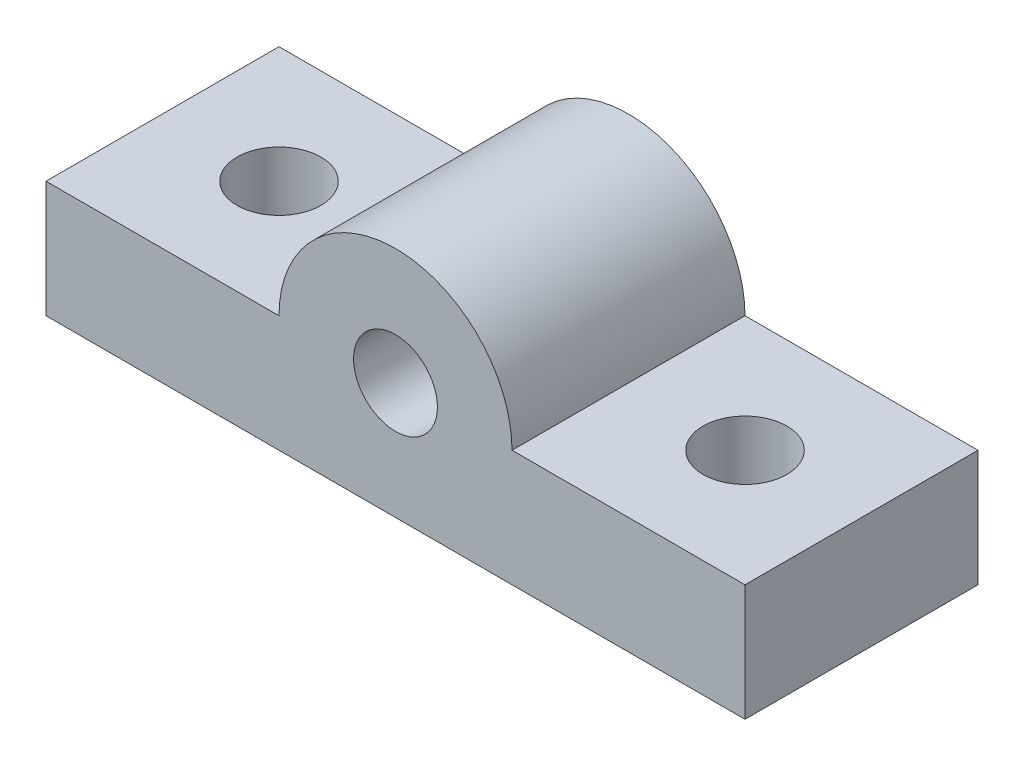
ISO-10303-21;
HEADER;
FILE_DESCRIPTION(('STEP AP214'),'2;1');
FILE_NAME('part.step','',(''),(''),'','','');
FILE_SCHEMA(('AUTOMOTIVE_DESIGN { 1 0 10303 214 1 1 1 1 }'));
ENDSEC;
DATA;
#1=APPLICATION_CONTEXT('core data for automotive mechanical design processes');
#2=APPLICATION_PROTOCOL_DEFINITION('international standard','automotive_design',2000,#1);
#3=PRODUCT_CONTEXT('',#1,'mechanical');
#4=PRODUCT('Part','Part','',(#3));
#5=PRODUCT_RELATED_PRODUCT_CATEGORY('part','',(#4));
#6=PRODUCT_DEFINITION_FORMATION('','',#4);
#7=PRODUCT_DEFINITION_CONTEXT('part definition',#1,'design');
#8=PRODUCT_DEFINITION('design','',#6,#7);
#9=PRODUCT_DEFINITION_SHAPE('','',#8);
#10=(LENGTH_UNIT() NAMED_UNIT(*) SI_UNIT(.MILLI.,.METRE.));
#11=(NAMED_UNIT(*) PLANE_ANGLE_UNIT() SI_UNIT($,.RADIAN.));
#12=(NAMED_UNIT(*) SI_UNIT($,.STERADIAN.) SOLID_ANGLE_UNIT());
#13=UNCERTAINTY_MEASURE_WITH_UNIT(LENGTH_MEASURE(1.E-05),#10,'distance_accuracy_value','');
#14=(GEOMETRIC_REPRESENTATION_CONTEXT(3) GLOBAL_UNCERTAINTY_ASSIGNED_CONTEXT((#13)) GLOBAL_UNIT_ASSIGNED_CONTEXT((#10,
#11,#12)) REPRESENTATION_CONTEXT('',''));
#15=CARTESIAN_POINT('',(0.,0.,0.));
#16=DIRECTION('',(0.,0.,1.));
#17=DIRECTION('',(1.,0.,0.));
#18=AXIS2_PLACEMENT_3D('',#15,#16,#17);
#19=CARTESIAN_POINT('',(0.,6.35,0.));
#20=DIRECTION('',(0.,1.,0.));
#21=DIRECTION('',(0.,0.,1.));
#22=AXIS2_PLACEMENT_3D('',#19,#20,#21);
#23=PLANE('',#22);
#24=DIRECTION('',(0.,0.,1.));
#25=VECTOR('',#24,1.);
#26=CARTESIAN_POINT('',(-6.35000000000001,6.35,-24.3105122421383));
#27=LINE('',#26,#25);
#28=CARTESIAN_POINT('',(-6.35000000000001,6.35,-6.35));
#29=VERTEX_POINT('',#28);
#30=CARTESIAN_POINT('',(-6.35000000000001,6.35,6.35));
#31=VERTEX_POINT('',#30);
#32=EDGE_CURVE('E107',#29,#31,#27,.T.);
#33=ORIENTED_EDGE('',*,*,#32,.F.);
#34=DIRECTION('',(-1.,0.,0.));
#35=VECTOR('',#34,1.);
#36=CARTESIAN_POINT('',(-19.05,6.35,-6.35));
#37=LINE('',#36,#35);
#38=CARTESIAN_POINT('',(-19.05,6.35,-6.35));
#39=VERTEX_POINT('',#38);
#40=EDGE_CURVE('E95',#29,#39,#37,.T.);
#41=ORIENTED_EDGE('',*,*,#40,.T.);
#42=DIRECTION('',(0.,0.,1.));
#43=VECTOR('',#42,1.);
#44=CARTESIAN_POINT('',(-19.05,6.35,-6.35));
#45=LINE('',#44,#43);
#46=CARTESIAN_POINT('',(-19.05,6.35,6.35));
#47=VERTEX_POINT('',#46);
#48=EDGE_CURVE('E148',#39,#47,#45,.T.);
#49=ORIENTED_EDGE('',*,*,#48,.T.);
#50=DIRECTION('',(1.,0.,0.));
#51=VECTOR('',#50,1.);
#52=CARTESIAN_POINT('',(-19.05,6.35,6.35));
#53=LINE('',#52,#51);
#54=EDGE_CURVE('E110',#47,#31,#53,.T.);
#55=ORIENTED_EDGE('',*,*,#54,.T.);
#56=EDGE_LOOP('',(#33,#41,#49,#55));
#57=FACE_BOUND('',#56,.T.);
#58=CARTESIAN_POINT('',(-12.7,6.35,0.));
#59=DIRECTION('',(0.,1.,0.));
#60=DIRECTION('',(0.,0.,1.));
#61=AXIS2_PLACEMENT_3D('',#58,#59,#60);
#62=CIRCLE('',#61,2.286);
#63=CARTESIAN_POINT('',(-12.7,6.35,2.286));
#64=VERTEX_POINT('',#63);
#65=EDGE_CURVE('E136',#64,#64,#62,.T.);
#66=ORIENTED_EDGE('',*,*,#65,.F.);
#67=EDGE_LOOP('',(#66));
#68=FACE_BOUND('',#67,.T.);
#69=ADVANCED_FACE('F43',(#57,#68),#23,.T.);
#70=DIRECTION('',(0.,0.,1.));
#71=VECTOR('',#70,1.);
#72=CARTESIAN_POINT('',(6.34999999999999,6.35,-24.3105122421383));
#73=LINE('',#72,#71);
#74=CARTESIAN_POINT('',(6.34999999999999,6.35,6.35));
#75=VERTEX_POINT('',#74);
#76=CARTESIAN_POINT('',(6.34999999999999,6.35,-6.35));
#77=VERTEX_POINT('',#76);
#78=EDGE_CURVE('E63',#75,#77,#73,.F.);
#79=ORIENTED_EDGE('',*,*,#78,.F.);
#80=CARTESIAN_POINT('',(19.05,6.35,6.35));
#81=VERTEX_POINT('',#80);
#82=EDGE_CURVE('E151',#75,#81,#53,.T.);
#83=ORIENTED_EDGE('',*,*,#82,.T.);
#84=DIRECTION('',(0.,0.,-1.));
#85=VECTOR('',#84,1.);
#86=CARTESIAN_POINT('',(19.05,6.35,-6.35));
#87=LINE('',#86,#85);
#88=CARTESIAN_POINT('',(19.05,6.35,-6.35));
#89=VERTEX_POINT('',#88);
#90=EDGE_CURVE('E104',#81,#89,#87,.T.);
#91=ORIENTED_EDGE('',*,*,#90,.T.);
#92=EDGE_CURVE('E59',#89,#77,#37,.T.);
#93=ORIENTED_EDGE('',*,*,#92,.T.);
#94=EDGE_LOOP('',(#79,#83,#91,#93));
#95=FACE_BOUND('',#94,.T.);
#96=CARTESIAN_POINT('',(12.7,6.35,0.));
#97=DIRECTION('',(0.,1.,0.));
#98=DIRECTION('',(0.,0.,1.));
#99=AXIS2_PLACEMENT_3D('',#96,#97,#98);
#100=CIRCLE('',#99,2.286);
#101=CARTESIAN_POINT('',(12.7,6.35,2.28599999999999));
#102=VERTEX_POINT('',#101);
#103=EDGE_CURVE('E128',#102,#102,#100,.T.);
#104=ORIENTED_EDGE('',*,*,#103,.F.);
#105=EDGE_LOOP('',(#104));
#106=FACE_BOUND('',#105,.T.);
#107=ADVANCED_FACE('F188',(#95,#106),#23,.T.);
#108=CARTESIAN_POINT('',(0.,0.,0.));
#109=DIRECTION('',(0.,1.,0.));
#110=DIRECTION('',(0.,0.,1.));
#111=AXIS2_PLACEMENT_3D('',#108,#109,#110);
#112=PLANE('',#111);
#113=DIRECTION('',(0.,0.,1.));
#114=VECTOR('',#113,1.);
#115=CARTESIAN_POINT('',(-19.05,0.,-6.35));
#116=LINE('',#115,#114);
#117=CARTESIAN_POINT('',(-19.05,0.,-6.35));
#118=VERTEX_POINT('',#117);
#119=CARTESIAN_POINT('',(-19.05,0.,6.35));
#120=VERTEX_POINT('',#119);
#121=EDGE_CURVE('E161',#118,#120,#116,.T.);
#122=ORIENTED_EDGE('',*,*,#121,.F.);
#123=DIRECTION('',(-1.,0.,0.));
#124=VECTOR('',#123,1.);
#125=CARTESIAN_POINT('',(-19.05,0.,-6.35));
#126=LINE('',#125,#124);
#127=CARTESIAN_POINT('',(19.05,0.,-6.35));
#128=VERTEX_POINT('',#127);
#129=EDGE_CURVE('E158',#128,#118,#126,.T.);
#130=ORIENTED_EDGE('',*,*,#129,.F.);
#131=DIRECTION('',(0.,0.,-1.));
#132=VECTOR('',#131,1.);
#133=CARTESIAN_POINT('',(19.05,0.,-6.35));
#134=LINE('',#133,#132);
#135=CARTESIAN_POINT('',(19.05,0.,6.35));
#136=VERTEX_POINT('',#135);
#137=EDGE_CURVE('E140',#136,#128,#134,.T.);
#138=ORIENTED_EDGE('',*,*,#137,.F.);
#139=DIRECTION('',(1.,0.,0.));
#140=VECTOR('',#139,1.);
#141=CARTESIAN_POINT('',(-19.05,0.,6.35));
#142=LINE('',#141,#140);
#143=EDGE_CURVE('E145',#120,#136,#142,.T.);
#144=ORIENTED_EDGE('',*,*,#143,.F.);
#145=EDGE_LOOP('',(#122,#130,#138,#144));
#146=FACE_BOUND('',#145,.T.);
#147=CARTESIAN_POINT('',(-12.7,0.,0.));
#148=DIRECTION('',(0.,1.,0.));
#149=DIRECTION('',(0.,0.,1.));
#150=AXIS2_PLACEMENT_3D('',#147,#148,#149);
#151=CIRCLE('',#150,2.286);
#152=CARTESIAN_POINT('',(-12.7,0.,2.286));
#153=VERTEX_POINT('',#152);
#154=EDGE_CURVE('E132',#153,#153,#151,.T.);
#155=ORIENTED_EDGE('',*,*,#154,.T.);
#156=EDGE_LOOP('',(#155));
#157=FACE_BOUND('',#156,.T.);
#158=CARTESIAN_POINT('',(12.7,0.,0.));
#159=DIRECTION('',(0.,1.,0.));
#160=DIRECTION('',(0.,0.,1.));
#161=AXIS2_PLACEMENT_3D('',#158,#159,#160);
#162=CIRCLE('',#161,2.286);
#163=CARTESIAN_POINT('',(12.7,0.,2.28599999999999));
#164=VERTEX_POINT('',#163);
#165=EDGE_CURVE('E115',#164,#164,#162,.T.);
#166=ORIENTED_EDGE('',*,*,#165,.T.);
#167=EDGE_LOOP('',(#166));
#168=FACE_BOUND('',#167,.T.);
#169=ADVANCED_FACE('F179',(#146,#157,#168),#112,.F.);
#170=CARTESIAN_POINT('',(19.05,6.35,-6.35));
#171=DIRECTION('',(-1.,0.,0.));
#172=DIRECTION('',(0.,0.,1.));
#173=AXIS2_PLACEMENT_3D('',#170,#171,#172);
#174=PLANE('',#173);
#175=ORIENTED_EDGE('',*,*,#137,.T.);
#176=DIRECTION('',(0.,-1.,0.));
#177=VECTOR('',#176,1.);
#178=CARTESIAN_POINT('',(19.05,6.35,-6.35));
#179=LINE('',#178,#177);
#180=EDGE_CURVE('E11',#89,#128,#179,.T.);
#181=ORIENTED_EDGE('',*,*,#180,.F.);
#182=ORIENTED_EDGE('',*,*,#90,.F.);
#183=DIRECTION('',(0.,-1.,0.));
#184=VECTOR('',#183,1.);
#185=CARTESIAN_POINT('',(19.05,6.35,6.35));
#186=LINE('',#185,#184);
#187=EDGE_CURVE('E154',#81,#136,#186,.T.);
#188=ORIENTED_EDGE('',*,*,#187,.T.);
#189=EDGE_LOOP('',(#175,#181,#182,#188));
#190=FACE_BOUND('',#189,.T.);
#191=ADVANCED_FACE('F45',(#190),#174,.F.);
#192=CARTESIAN_POINT('',(-19.05,6.35,-6.35));
#193=DIRECTION('',(0.,0.,1.));
#194=DIRECTION('',(1.,0.,0.));
#195=AXIS2_PLACEMENT_3D('',#192,#193,#194);
#196=PLANE('',#195);
#197=CARTESIAN_POINT('',(0.,6.35,-6.35));
#198=DIRECTION('',(0.,0.,1.));
#199=DIRECTION('',(1.,0.,0.));
#200=AXIS2_PLACEMENT_3D('',#197,#198,#199);
#201=CIRCLE('',#200,2.286);
#202=CARTESIAN_POINT('',(2.28599999999999,6.35,-6.35));
#203=VERTEX_POINT('',#202);
#204=EDGE_CURVE('E124',#203,#203,#201,.T.);
#205=ORIENTED_EDGE('',*,*,#204,.T.);
#206=EDGE_LOOP('',(#205));
#207=FACE_BOUND('',#206,.T.);
#208=ORIENTED_EDGE('',*,*,#129,.T.);
#209=DIRECTION('',(0.,-1.,0.));
#210=VECTOR('',#209,1.);
#211=CARTESIAN_POINT('',(-19.05,6.35,-6.35));
#212=LINE('',#211,#210);
#213=EDGE_CURVE('E52',#39,#118,#212,.T.);
#214=ORIENTED_EDGE('',*,*,#213,.F.);
#215=ORIENTED_EDGE('',*,*,#40,.F.);
#216=CARTESIAN_POINT('',(0.,6.35,-6.35));
#217=DIRECTION('',(0.,0.,1.));
#218=DIRECTION('',(1.,0.,0.));
#219=AXIS2_PLACEMENT_3D('',#216,#217,#218);
#220=CIRCLE('',#219,6.35);
#221=EDGE_CURVE('E99',#29,#77,#220,.F.);
#222=ORIENTED_EDGE('',*,*,#221,.T.);
#223=ORIENTED_EDGE('',*,*,#92,.F.);
#224=ORIENTED_EDGE('',*,*,#180,.T.);
#225=EDGE_LOOP('',(#208,#214,#215,#222,#223,#224));
#226=FACE_BOUND('',#225,.T.);
#227=ADVANCED_FACE('F97',(#207,#226),#196,.F.);
#228=CARTESIAN_POINT('',(-19.05,6.35,-6.35));
#229=DIRECTION('',(1.,0.,0.));
#230=DIRECTION('',(0.,0.,-1.));
#231=AXIS2_PLACEMENT_3D('',#228,#229,#230);
#232=PLANE('',#231);
#233=ORIENTED_EDGE('',*,*,#121,.T.);
#234=DIRECTION('',(0.,-1.,0.));
#235=VECTOR('',#234,1.);
#236=CARTESIAN_POINT('',(-19.05,6.35,6.35));
#237=LINE('',#236,#235);
#238=EDGE_CURVE('E169',#47,#120,#237,.T.);
#239=ORIENTED_EDGE('',*,*,#238,.F.);
#240=ORIENTED_EDGE('',*,*,#48,.F.);
#241=ORIENTED_EDGE('',*,*,#213,.T.);
#242=EDGE_LOOP('',(#233,#239,#240,#241));
#243=FACE_BOUND('',#242,.T.);
#244=ADVANCED_FACE('F175',(#243),#232,.F.);
#245=CARTESIAN_POINT('',(-19.05,6.35,6.35));
#246=DIRECTION('',(0.,0.,-1.));
#247=DIRECTION('',(-1.,0.,0.));
#248=AXIS2_PLACEMENT_3D('',#245,#246,#247);
#249=PLANE('',#248);
#250=CARTESIAN_POINT('',(0.,6.35,6.35));
#251=DIRECTION('',(0.,0.,1.));
#252=DIRECTION('',(1.,0.,0.));
#253=AXIS2_PLACEMENT_3D('',#250,#251,#252);
#254=CIRCLE('',#253,2.286);
#255=CARTESIAN_POINT('',(2.28599999999999,6.35,6.35));
#256=VERTEX_POINT('',#255);
#257=EDGE_CURVE('E229',#256,#256,#254,.T.);
#258=ORIENTED_EDGE('',*,*,#257,.F.);
#259=EDGE_LOOP('',(#258));
#260=FACE_BOUND('',#259,.T.);
#261=ORIENTED_EDGE('',*,*,#143,.T.);
#262=ORIENTED_EDGE('',*,*,#187,.F.);
#263=ORIENTED_EDGE('',*,*,#82,.F.);
#264=CARTESIAN_POINT('',(0.,6.35,6.35));
#265=DIRECTION('',(0.,0.,1.));
#266=DIRECTION('',(1.,0.,0.));
#267=AXIS2_PLACEMENT_3D('',#264,#265,#266);
#268=CIRCLE('',#267,6.35);
#269=EDGE_CURVE('E119',#75,#31,#268,.T.);
#270=ORIENTED_EDGE('',*,*,#269,.T.);
#271=ORIENTED_EDGE('',*,*,#54,.F.);
#272=ORIENTED_EDGE('',*,*,#238,.T.);
#273=EDGE_LOOP('',(#261,#262,#263,#270,#271,#272));
#274=FACE_BOUND('',#273,.T.);
#275=ADVANCED_FACE('F184',(#260,#274),#249,.F.);
#276=CARTESIAN_POINT('',(-12.7,6.35,0.));
#277=DIRECTION('',(0.,-1.,0.));
#278=DIRECTION('',(0.,0.,-1.));
#279=AXIS2_PLACEMENT_3D('',#276,#277,#278);
#280=CYLINDRICAL_SURFACE('',#279,2.286);
#281=ORIENTED_EDGE('',*,*,#65,.T.);
#282=EDGE_LOOP('',(#281));
#283=FACE_BOUND('',#282,.T.);
#284=ORIENTED_EDGE('',*,*,#154,.F.);
#285=EDGE_LOOP('',(#284));
#286=FACE_BOUND('',#285,.T.);
#287=ADVANCED_FACE('F198',(#283,#286),#280,.F.);
#288=CARTESIAN_POINT('',(12.7,6.35,0.));
#289=DIRECTION('',(0.,-1.,0.));
#290=DIRECTION('',(0.,0.,-1.));
#291=AXIS2_PLACEMENT_3D('',#288,#289,#290);
#292=CYLINDRICAL_SURFACE('',#291,2.286);
#293=ORIENTED_EDGE('',*,*,#103,.T.);
#294=EDGE_LOOP('',(#293));
#295=FACE_BOUND('',#294,.T.);
#296=ORIENTED_EDGE('',*,*,#165,.F.);
#297=EDGE_LOOP('',(#296));
#298=FACE_BOUND('',#297,.T.);
#299=ADVANCED_FACE('F195',(#295,#298),#292,.F.);
#300=CARTESIAN_POINT('',(0.,6.35,-24.3105122421383));
#301=DIRECTION('',(0.,0.,1.));
#302=DIRECTION('',(1.,0.,0.));
#303=AXIS2_PLACEMENT_3D('',#300,#301,#302);
#304=CYLINDRICAL_SURFACE('',#303,6.35);
#305=ORIENTED_EDGE('',*,*,#221,.F.);
#306=ORIENTED_EDGE('',*,*,#32,.T.);
#307=ORIENTED_EDGE('',*,*,#269,.F.);
#308=ORIENTED_EDGE('',*,*,#78,.T.);
#309=EDGE_LOOP('',(#305,#306,#307,#308));
#310=FACE_BOUND('',#309,.T.);
#311=ADVANCED_FACE('F117',(#310),#304,.T.);
#312=CARTESIAN_POINT('',(0.,6.35,-6.35));
#313=DIRECTION('',(0.,0.,1.));
#314=DIRECTION('',(1.,0.,0.));
#315=AXIS2_PLACEMENT_3D('',#312,#313,#314);
#316=CYLINDRICAL_SURFACE('',#315,2.286);
#317=CARTESIAN_POINT('',(2.28599999999999,6.35,-6.35));
#318=CARTESIAN_POINT('',(2.28599999999999,6.35,-6.21770833333334));
#319=CARTESIAN_POINT('',(2.28599999999999,6.35,-6.08541666666667));
#320=CARTESIAN_POINT('',(2.28599999999999,6.35,-5.82083333333333));
#321=CARTESIAN_POINT('',(2.28599999999999,6.35,-5.68854166666667));
#322=CARTESIAN_POINT('',(2.28599999999999,6.35,-5.42395833333333));
#323=CARTESIAN_POINT('',(2.28599999999999,6.35,-5.29166666666667));
#324=CARTESIAN_POINT('',(2.28599999999999,6.35,-5.02708333333333));
#325=CARTESIAN_POINT('',(2.28599999999999,6.35,-4.89479166666667));
#326=CARTESIAN_POINT('',(2.28599999999999,6.35,-4.63020833333333));
#327=CARTESIAN_POINT('',(2.28599999999999,6.35,-4.49791666666667));
#328=CARTESIAN_POINT('',(2.28599999999999,6.35,-4.23333333333333));
#329=CARTESIAN_POINT('',(2.28599999999999,6.35,-4.10104166666667));
#330=CARTESIAN_POINT('',(2.28599999999999,6.35,-3.83645833333334));
#331=CARTESIAN_POINT('',(2.28599999999999,6.35,-3.70416666666667));
#332=CARTESIAN_POINT('',(2.28599999999999,6.35,-3.43958333333333));
#333=CARTESIAN_POINT('',(2.28599999999999,6.35,-3.30729166666667));
#334=CARTESIAN_POINT('',(2.28599999999999,6.35,-3.04270833333333));
#335=CARTESIAN_POINT('',(2.28599999999999,6.35,-2.91041666666667));
#336=CARTESIAN_POINT('',(2.28599999999999,6.35,-2.64583333333334));
#337=CARTESIAN_POINT('',(2.28599999999999,6.35,-2.51354166666667));
#338=CARTESIAN_POINT('',(2.28599999999999,6.35,-2.24895833333334));
#339=CARTESIAN_POINT('',(2.28599999999999,6.35,-2.11666666666667));
#340=CARTESIAN_POINT('',(2.28599999999999,6.35,-1.85208333333334));
#341=CARTESIAN_POINT('',(2.28599999999999,6.35,-1.71979166666667));
#342=CARTESIAN_POINT('',(2.28599999999999,6.35,-1.45520833333334));
#343=CARTESIAN_POINT('',(2.28599999999999,6.35,-1.32291666666667));
#344=CARTESIAN_POINT('',(2.28599999999999,6.35,-1.05833333333334));
#345=CARTESIAN_POINT('',(2.28599999999999,6.35,-0.926041666666669));
#346=CARTESIAN_POINT('',(2.28599999999999,6.35,-0.661458333333335));
#347=CARTESIAN_POINT('',(2.28599999999999,6.35,-0.529166666666668));
#348=CARTESIAN_POINT('',(2.28599999999999,6.35,-0.264583333333335));
#349=CARTESIAN_POINT('',(2.28599999999999,6.35,-0.132291666666668));
#350=CARTESIAN_POINT('',(2.28599999999999,6.35,0.132291666666665));
#351=CARTESIAN_POINT('',(2.28599999999999,6.35,0.264583333333331));
#352=CARTESIAN_POINT('',(2.28599999999999,6.35,0.529166666666665));
#353=CARTESIAN_POINT('',(2.28599999999999,6.35,0.661458333333332));
#354=CARTESIAN_POINT('',(2.28599999999999,6.35,0.926041666666665));
#355=CARTESIAN_POINT('',(2.28599999999999,6.35,1.05833333333333));
#356=CARTESIAN_POINT('',(2.28599999999999,6.35,1.32291666666667));
#357=CARTESIAN_POINT('',(2.28599999999999,6.35,1.45520833333333));
#358=CARTESIAN_POINT('',(2.28599999999999,6.35,1.71979166666667));
#359=CARTESIAN_POINT('',(2.28599999999999,6.35,1.85208333333333));
#360=CARTESIAN_POINT('',(2.28599999999999,6.35,2.11666666666667));
#361=CARTESIAN_POINT('',(2.28599999999999,6.35,2.24895833333333));
#362=CARTESIAN_POINT('',(2.28599999999999,6.35,2.51354166666667));
#363=CARTESIAN_POINT('',(2.28599999999999,6.35,2.64583333333333));
#364=CARTESIAN_POINT('',(2.28599999999999,6.35,2.91041666666667));
#365=CARTESIAN_POINT('',(2.28599999999999,6.35,3.04270833333333));
#366=CARTESIAN_POINT('',(2.28599999999999,6.35,3.30729166666667));
#367=CARTESIAN_POINT('',(2.28599999999999,6.35,3.43958333333333));
#368=CARTESIAN_POINT('',(2.28599999999999,6.35,3.70416666666667));
#369=CARTESIAN_POINT('',(2.28599999999999,6.35,3.83645833333333));
#370=CARTESIAN_POINT('',(2.28599999999999,6.35,4.10104166666667));
#371=CARTESIAN_POINT('',(2.28599999999999,6.35,4.23333333333333));
#372=CARTESIAN_POINT('',(2.28599999999999,6.35,4.49791666666667));
#373=CARTESIAN_POINT('',(2.28599999999999,6.35,4.63020833333333));
#374=CARTESIAN_POINT('',(2.28599999999999,6.35,4.89479166666667));
#375=CARTESIAN_POINT('',(2.28599999999999,6.35,5.02708333333333));
#376=CARTESIAN_POINT('',(2.28599999999999,6.35,5.29166666666667));
#377=CARTESIAN_POINT('',(2.28599999999999,6.35,5.42395833333333));
#378=CARTESIAN_POINT('',(2.28599999999999,6.35,5.68854166666667));
#379=CARTESIAN_POINT('',(2.28599999999999,6.35,5.82083333333333));
#380=CARTESIAN_POINT('',(2.28599999999999,6.35,6.08541666666667));
#381=CARTESIAN_POINT('',(2.28599999999999,6.35,6.21770833333333));
#382=CARTESIAN_POINT('',(2.28599999999999,6.35,6.35));
#383=B_SPLINE_CURVE_WITH_KNOTS('',3,(#317,#318,#319,#320,#321,#322,#323,#324,#325,#326,#327,
#328,#329,#330,#331,#332,#333,#334,#335,#336,#337,#338,#339,#340,#341,#342,#343,#344,#345,#346,
#347,#348,#349,#350,#351,#352,#353,#354,#355,#356,#357,#358,#359,#360,#361,#362,#363,#364,#365,
#366,#367,#368,#369,#370,#371,#372,#373,#374,#375,#376,#377,#378,#379,#380,#381,#382),
.UNSPECIFIED.,.F.,.F.,(4,2,2,2,2,2,2,2,2,2,2,2,2,2,2,2,2,2,2,2,2,2,2,2,2,2,2,2,2,2,2,2,4),(0.,
0.396875000000001,0.79375,1.190625,1.5875,1.984375,2.38125,2.778125,3.175,3.571875,3.96875,
4.365625,4.7625,5.159375,5.55625,5.953125,6.35,6.746875,7.14375,7.540625,7.9375,8.334375,
8.73125,9.128125,9.525,9.921875,10.31875,10.715625,11.1125,11.509375,11.90625,12.303125,12.7),.UNSPECIFIED.);
#384=EDGE_CURVE('BSEAM219',#203,#256,#383,.T.);
#385=ORIENTED_EDGE('',*,*,#204,.F.);
#386=ORIENTED_EDGE('',*,*,#257,.T.);
#387=ORIENTED_EDGE('',*,*,#384,.T.);
#388=ORIENTED_EDGE('',*,*,#384,.F.);
#389=EDGE_LOOP('',(#385,#387,#386,#388));
#390=FACE_BOUND('',#389,.T.);
#391=ADVANCED_FACE('F219',(#390),#316,.F.);
#392=CLOSED_SHELL('',(#69,#107,#169,#191,#227,#244,#275,#287,#299,#311,#391));
#393=MANIFOLD_SOLID_BREP('B2',#392);
#394=ADVANCED_BREP_SHAPE_REPRESENTATION('',(#18,#393),#14);
#395=SHAPE_DEFINITION_REPRESENTATION(#9,#394);
ENDSEC;
END-ISO-10303-21;
